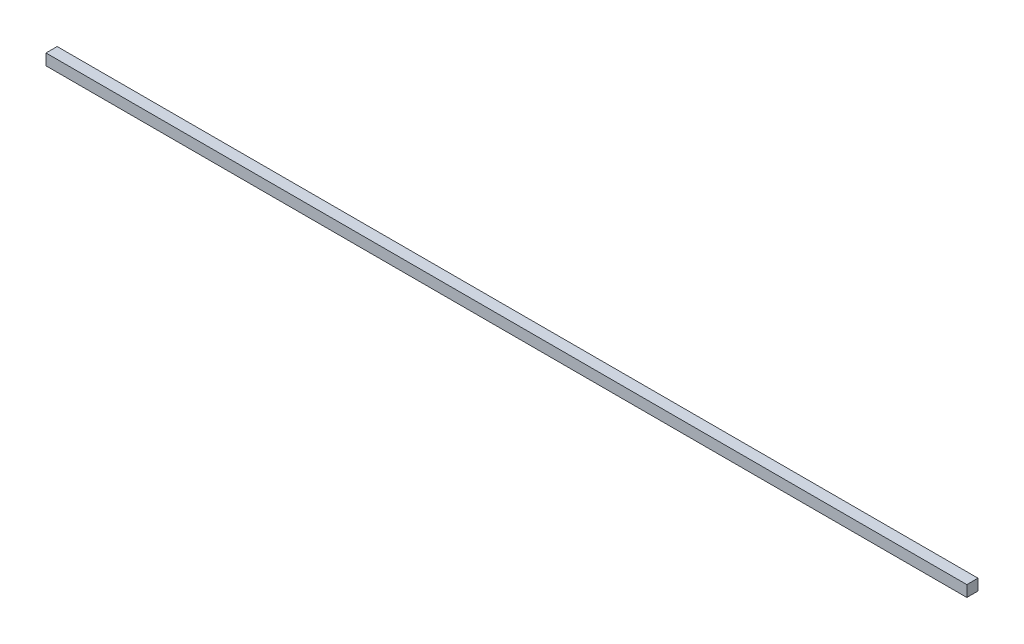
ISO-10303-21;
HEADER;
FILE_DESCRIPTION(('STEP AP214'),'2;1');
FILE_NAME('part.step','',(''),(''),'','','');
FILE_SCHEMA(('AUTOMOTIVE_DESIGN { 1 0 10303 214 1 1 1 1 }'));
ENDSEC;
DATA;
#1=APPLICATION_CONTEXT('core data for automotive mechanical design processes');
#2=APPLICATION_PROTOCOL_DEFINITION('international standard','automotive_design',2000,#1);
#3=PRODUCT_CONTEXT('',#1,'mechanical');
#4=PRODUCT('Part','Part','',(#3));
#5=PRODUCT_RELATED_PRODUCT_CATEGORY('part','',(#4));
#6=PRODUCT_DEFINITION_FORMATION('','',#4);
#7=PRODUCT_DEFINITION_CONTEXT('part definition',#1,'design');
#8=PRODUCT_DEFINITION('design','',#6,#7);
#9=PRODUCT_DEFINITION_SHAPE('','',#8);
#10=(LENGTH_UNIT() NAMED_UNIT(*) SI_UNIT(.MILLI.,.METRE.));
#11=(NAMED_UNIT(*) PLANE_ANGLE_UNIT() SI_UNIT($,.RADIAN.));
#12=(NAMED_UNIT(*) SI_UNIT($,.STERADIAN.) SOLID_ANGLE_UNIT());
#13=UNCERTAINTY_MEASURE_WITH_UNIT(LENGTH_MEASURE(1.E-05),#10,'distance_accuracy_value','');
#14=(GEOMETRIC_REPRESENTATION_CONTEXT(3) GLOBAL_UNCERTAINTY_ASSIGNED_CONTEXT((#13)) GLOBAL_UNIT_ASSIGNED_CONTEXT((#10,
#11,#12)) REPRESENTATION_CONTEXT('',''));
#15=CARTESIAN_POINT('',(0.,0.,0.));
#16=DIRECTION('',(0.,0.,1.));
#17=DIRECTION('',(1.,0.,0.));
#18=AXIS2_PLACEMENT_3D('',#15,#16,#17);
#19=CARTESIAN_POINT('',(20.,462.,30.));
#20=DIRECTION('',(1.,0.,0.));
#21=DIRECTION('',(0.,0.,-1.));
#22=AXIS2_PLACEMENT_3D('',#19,#20,#21);
#23=PLANE('',#22);
#24=DIRECTION('',(0.,-1.,0.));
#25=VECTOR('',#24,1.);
#26=CARTESIAN_POINT('',(20.,462.,22.));
#27=LINE('',#26,#25);
#28=CARTESIAN_POINT('',(20.,470.,22.));
#29=VERTEX_POINT('',#28);
#30=CARTESIAN_POINT('',(20.,462.,22.));
#31=VERTEX_POINT('',#30);
#32=EDGE_CURVE('E102',#29,#31,#27,.T.);
#33=ORIENTED_EDGE('',*,*,#32,.T.);
#34=DIRECTION('',(0.,0.,-1.));
#35=VECTOR('',#34,1.);
#36=CARTESIAN_POINT('',(20.,462.,30.));
#37=LINE('',#36,#35);
#38=CARTESIAN_POINT('',(20.,462.,30.));
#39=VERTEX_POINT('',#38);
#40=EDGE_CURVE('E11',#39,#31,#37,.T.);
#41=ORIENTED_EDGE('',*,*,#40,.F.);
#42=DIRECTION('',(0.,-1.,0.));
#43=VECTOR('',#42,1.);
#44=CARTESIAN_POINT('',(20.,462.,30.));
#45=LINE('',#44,#43);
#46=CARTESIAN_POINT('',(20.,470.,30.));
#47=VERTEX_POINT('',#46);
#48=EDGE_CURVE('E90',#47,#39,#45,.T.);
#49=ORIENTED_EDGE('',*,*,#48,.F.);
#50=DIRECTION('',(0.,0.,-1.));
#51=VECTOR('',#50,1.);
#52=CARTESIAN_POINT('',(20.,470.,30.));
#53=LINE('',#52,#51);
#54=EDGE_CURVE('E98',#47,#29,#53,.T.);
#55=ORIENTED_EDGE('',*,*,#54,.T.);
#56=EDGE_LOOP('',(#33,#41,#49,#55));
#57=FACE_BOUND('',#56,.T.);
#58=ADVANCED_FACE('F39',(#57),#23,.F.);
#59=CARTESIAN_POINT('',(20.,462.,30.));
#60=DIRECTION('',(0.,1.,0.));
#61=DIRECTION('',(0.,0.,1.));
#62=AXIS2_PLACEMENT_3D('',#59,#60,#61);
#63=PLANE('',#62);
#64=DIRECTION('',(1.,0.,0.));
#65=VECTOR('',#64,1.);
#66=CARTESIAN_POINT('',(20.,462.,22.));
#67=LINE('',#66,#65);
#68=CARTESIAN_POINT('',(680.,462.,22.));
#69=VERTEX_POINT('',#68);
#70=EDGE_CURVE('E94',#31,#69,#67,.T.);
#71=ORIENTED_EDGE('',*,*,#70,.T.);
#72=DIRECTION('',(0.,0.,-1.));
#73=VECTOR('',#72,1.);
#74=CARTESIAN_POINT('',(680.,462.,30.));
#75=LINE('',#74,#73);
#76=CARTESIAN_POINT('',(680.,462.,30.));
#77=VERTEX_POINT('',#76);
#78=EDGE_CURVE('E47',#77,#69,#75,.T.);
#79=ORIENTED_EDGE('',*,*,#78,.F.);
#80=DIRECTION('',(1.,0.,0.));
#81=VECTOR('',#80,1.);
#82=CARTESIAN_POINT('',(20.,462.,30.));
#83=LINE('',#82,#81);
#84=EDGE_CURVE('E85',#39,#77,#83,.T.);
#85=ORIENTED_EDGE('',*,*,#84,.F.);
#86=ORIENTED_EDGE('',*,*,#40,.T.);
#87=EDGE_LOOP('',(#71,#79,#85,#86));
#88=FACE_BOUND('',#87,.T.);
#89=ADVANCED_FACE('F93',(#88),#63,.F.);
#90=CARTESIAN_POINT('',(680.,462.,30.));
#91=DIRECTION('',(-1.,0.,0.));
#92=DIRECTION('',(0.,0.,1.));
#93=AXIS2_PLACEMENT_3D('',#90,#91,#92);
#94=PLANE('',#93);
#95=DIRECTION('',(0.,1.,0.));
#96=VECTOR('',#95,1.);
#97=CARTESIAN_POINT('',(680.,462.,22.));
#98=LINE('',#97,#96);
#99=CARTESIAN_POINT('',(680.,470.,22.));
#100=VERTEX_POINT('',#99);
#101=EDGE_CURVE('E72',#69,#100,#98,.T.);
#102=ORIENTED_EDGE('',*,*,#101,.T.);
#103=DIRECTION('',(0.,0.,-1.));
#104=VECTOR('',#103,1.);
#105=CARTESIAN_POINT('',(680.,470.,30.));
#106=LINE('',#105,#104);
#107=CARTESIAN_POINT('',(680.,470.,30.));
#108=VERTEX_POINT('',#107);
#109=EDGE_CURVE('E95',#108,#100,#106,.T.);
#110=ORIENTED_EDGE('',*,*,#109,.F.);
#111=DIRECTION('',(0.,1.,0.));
#112=VECTOR('',#111,1.);
#113=CARTESIAN_POINT('',(680.,462.,30.));
#114=LINE('',#113,#112);
#115=EDGE_CURVE('E88',#77,#108,#114,.T.);
#116=ORIENTED_EDGE('',*,*,#115,.F.);
#117=ORIENTED_EDGE('',*,*,#78,.T.);
#118=EDGE_LOOP('',(#102,#110,#116,#117));
#119=FACE_BOUND('',#118,.T.);
#120=ADVANCED_FACE('F96',(#119),#94,.F.);
#121=CARTESIAN_POINT('',(20.,470.,30.));
#122=DIRECTION('',(0.,-1.,0.));
#123=DIRECTION('',(0.,0.,-1.));
#124=AXIS2_PLACEMENT_3D('',#121,#122,#123);
#125=PLANE('',#124);
#126=DIRECTION('',(-1.,0.,0.));
#127=VECTOR('',#126,1.);
#128=CARTESIAN_POINT('',(20.,470.,22.));
#129=LINE('',#128,#127);
#130=EDGE_CURVE('E78',#100,#29,#129,.T.);
#131=ORIENTED_EDGE('',*,*,#130,.T.);
#132=ORIENTED_EDGE('',*,*,#54,.F.);
#133=DIRECTION('',(-1.,0.,0.));
#134=VECTOR('',#133,1.);
#135=CARTESIAN_POINT('',(20.,470.,30.));
#136=LINE('',#135,#134);
#137=EDGE_CURVE('E55',#108,#47,#136,.T.);
#138=ORIENTED_EDGE('',*,*,#137,.F.);
#139=ORIENTED_EDGE('',*,*,#109,.T.);
#140=EDGE_LOOP('',(#131,#132,#138,#139));
#141=FACE_BOUND('',#140,.T.);
#142=ADVANCED_FACE('F109',(#141),#125,.F.);
#143=CARTESIAN_POINT('',(0.,0.,30.));
#144=DIRECTION('',(0.,0.,-1.));
#145=DIRECTION('',(-1.,0.,0.));
#146=AXIS2_PLACEMENT_3D('',#143,#144,#145);
#147=PLANE('',#146);
#148=ORIENTED_EDGE('',*,*,#48,.T.);
#149=ORIENTED_EDGE('',*,*,#84,.T.);
#150=ORIENTED_EDGE('',*,*,#115,.T.);
#151=ORIENTED_EDGE('',*,*,#137,.T.);
#152=EDGE_LOOP('',(#148,#149,#150,#151));
#153=FACE_BOUND('',#152,.T.);
#154=ADVANCED_FACE('F86',(#153),#147,.F.);
#155=CARTESIAN_POINT('',(0.,0.,22.));
#156=DIRECTION('',(0.,0.,-1.));
#157=DIRECTION('',(-1.,0.,0.));
#158=AXIS2_PLACEMENT_3D('',#155,#156,#157);
#159=PLANE('',#158);
#160=ORIENTED_EDGE('',*,*,#32,.F.);
#161=ORIENTED_EDGE('',*,*,#130,.F.);
#162=ORIENTED_EDGE('',*,*,#101,.F.);
#163=ORIENTED_EDGE('',*,*,#70,.F.);
#164=EDGE_LOOP('',(#160,#161,#162,#163));
#165=FACE_BOUND('',#164,.T.);
#166=ADVANCED_FACE('F112',(#165),#159,.T.);
#167=CLOSED_SHELL('',(#58,#89,#120,#142,#154,#166));
#168=MANIFOLD_SOLID_BREP('B2',#167);
#169=ADVANCED_BREP_SHAPE_REPRESENTATION('',(#18,#168),#14);
#170=SHAPE_DEFINITION_REPRESENTATION(#9,#169);
ENDSEC;
END-ISO-10303-21;
